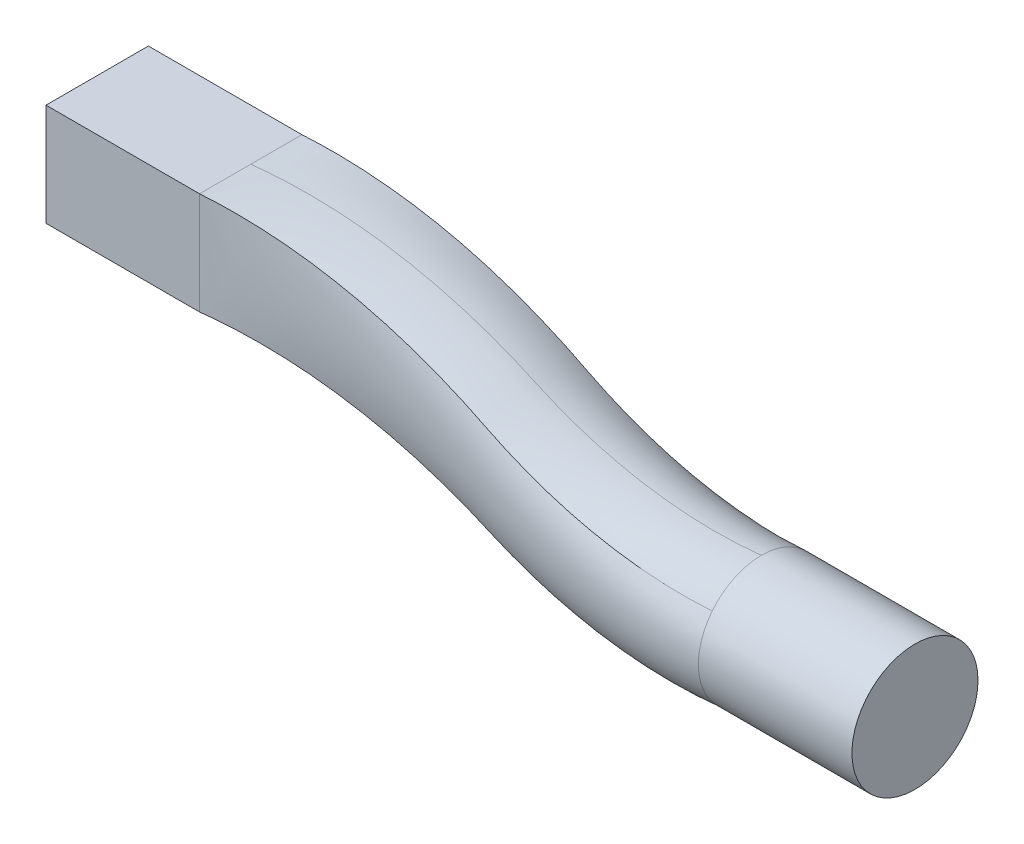
ISO-10303-21;
HEADER;
FILE_DESCRIPTION(('STEP AP214'),'2;1');
FILE_NAME('part.step','',(''),(''),'','','');
FILE_SCHEMA(('AUTOMOTIVE_DESIGN { 1 0 10303 214 1 1 1 1 }'));
ENDSEC;
DATA;
#1=APPLICATION_CONTEXT('core data for automotive mechanical design processes');
#2=APPLICATION_PROTOCOL_DEFINITION('international standard','automotive_design',2000,#1);
#3=PRODUCT_CONTEXT('',#1,'mechanical');
#4=PRODUCT('Part','Part','',(#3));
#5=PRODUCT_RELATED_PRODUCT_CATEGORY('part','',(#4));
#6=PRODUCT_DEFINITION_FORMATION('','',#4);
#7=PRODUCT_DEFINITION_CONTEXT('part definition',#1,'design');
#8=PRODUCT_DEFINITION('design','',#6,#7);
#9=PRODUCT_DEFINITION_SHAPE('','',#8);
#10=(LENGTH_UNIT() NAMED_UNIT(*) SI_UNIT(.MILLI.,.METRE.));
#11=(NAMED_UNIT(*) PLANE_ANGLE_UNIT() SI_UNIT($,.RADIAN.));
#12=(NAMED_UNIT(*) SI_UNIT($,.STERADIAN.) SOLID_ANGLE_UNIT());
#13=UNCERTAINTY_MEASURE_WITH_UNIT(LENGTH_MEASURE(1.E-05),#10,'distance_accuracy_value','');
#14=(GEOMETRIC_REPRESENTATION_CONTEXT(3) GLOBAL_UNCERTAINTY_ASSIGNED_CONTEXT((#13)) GLOBAL_UNIT_ASSIGNED_CONTEXT((#10,
#11,#12)) REPRESENTATION_CONTEXT('',''));
#15=CARTESIAN_POINT('',(0.,0.,0.));
#16=DIRECTION('',(0.,0.,1.));
#17=DIRECTION('',(1.,0.,0.));
#18=AXIS2_PLACEMENT_3D('',#15,#16,#17);
#19=CARTESIAN_POINT('',(1018.70288688526,-111.327969278225,98.1786354112722));
#20=CARTESIAN_POINT('',(864.195022169251,-121.253897370635,98.7596032718136));
#21=CARTESIAN_POINT('',(707.982737110856,-88.8067003141855,99.340571132355));
#22=CARTESIAN_POINT('',(389.792361381204,73.7067384013296,100.650359328598));
#23=CARTESIAN_POINT('',(193.839936106772,114.46066408754,101.379179664299));
#24=CARTESIAN_POINT('',(0.,102.108,102.108));
#25=CARTESIAN_POINT('',(1018.70288688526,-107.823826946939,95.375321546243));
#26=CARTESIAN_POINT('',(864.195022169251,-118.26785256562,95.7101235236934));
#27=CARTESIAN_POINT('',(707.982737110856,-86.3387530354427,96.0449255011437));
#28=CARTESIAN_POINT('',(389.792361381204,75.0066382363103,96.7997343432964));
#29=CARTESIAN_POINT('',(193.839936106772,115.11061400503,97.2197412079987));
#30=CARTESIAN_POINT('',(0.,102.108,97.639748072701));
#31=CARTESIAN_POINT('',(1018.70288688526,-101.04186585455,89.3334158306901));
#32=CARTESIAN_POINT('',(864.195022169251,-112.488623934715,89.2574022157566));
#33=CARTESIAN_POINT('',(707.982737110856,-81.5622568660207,89.181388600823));
#34=CARTESIAN_POINT('',(389.792361381204,77.5224807082695,89.0100164090793));
#35=CARTESIAN_POINT('',(193.839936106772,116.36853524101,88.914657832269));
#36=CARTESIAN_POINT('',(0.,102.108,88.8192992554588));
#37=CARTESIAN_POINT('',(1018.70288688526,-91.7521778938547,79.0307499945835));
#38=CARTESIAN_POINT('',(864.195022169253,-104.572443068552,78.5615032950265));
#39=CARTESIAN_POINT('',(707.982737110858,-75.0195830943902,78.0922565954694));
#40=CARTESIAN_POINT('',(389.792361381205,80.9685918263349,77.0343430171986));
#41=CARTESIAN_POINT('',(193.839936106772,118.091590800043,76.4456761384849));
#42=CARTESIAN_POINT('',(0.,102.108,75.8570092597712));
#43=CARTESIAN_POINT('',(1018.70288688526,-83.5443662608268,67.5978041436648));
#44=CARTESIAN_POINT('',(864.195022169248,-97.5781800020903,66.9303247638813));
#45=CARTESIAN_POINT('',(707.982737110854,-69.2388685944949,66.2628453840979));
#46=CARTESIAN_POINT('',(389.792361381203,84.0133691152208,64.7580175403322));
#47=CARTESIAN_POINT('',(193.839936106771,119.613979444486,63.92066907635));
#48=CARTESIAN_POINT('',(0.,102.108,63.0833206123677));
#49=CARTESIAN_POINT('',(1018.70288688527,-76.5998022636083,55.1867324526258));
#50=CARTESIAN_POINT('',(864.195022169254,-91.6603897736971,54.4847712146526));
#51=CARTESIAN_POINT('',(707.982737110859,-64.3478521349271,53.7828099766794));
#52=CARTESIAN_POINT('',(389.792361381206,86.5895309090492,52.2002430118558));
#53=CARTESIAN_POINT('',(193.839936106773,120.9020603414,51.3196372850053));
#54=CARTESIAN_POINT('',(0.,102.108,50.4390315581548));
#55=CARTESIAN_POINT('',(1018.70288688526,-71.0710045535372,41.9885353472462));
#56=CARTESIAN_POINT('',(864.195022169249,-86.9490407132628,41.3788499607623));
#57=CARTESIAN_POINT('',(707.982737110855,-60.4539517241296,40.7691645742784));
#58=CARTESIAN_POINT('',(389.792361381204,88.6404987498229,39.3946329058759));
#59=CARTESIAN_POINT('',(193.839936106772,121.927544261787,38.6297866239573));
#60=CARTESIAN_POINT('',(0.,102.108,37.8649403420387));
#61=CARTESIAN_POINT('',(1018.70288688527,-67.071410201011,28.2249488574512));
#62=CARTESIAN_POINT('',(864.195022169254,-83.5407978939302,27.7935983640975));
#63=CARTESIAN_POINT('',(707.982737110858,-57.6370604379905,27.3622478707438));
#64=CARTESIAN_POINT('',(389.792361381205,90.1241919184533,26.3897710385288));
#65=CARTESIAN_POINT('',(193.839936106773,122.669390846102,25.8486446996674));
#66=CARTESIAN_POINT('',(0.,102.108,25.307518360806));
#67=CARTESIAN_POINT('',(1018.70288688526,-64.667830339664,14.1371488318967));
#68=CARTESIAN_POINT('',(864.195022169248,-81.4925942309876,13.9266193721418));
#69=CARTESIAN_POINT('',(707.982737110854,-55.9442329734523,13.7160899123869));
#70=CARTESIAN_POINT('',(389.792361381203,91.0158260958758,13.2414526388356));
#71=CARTESIAN_POINT('',(193.839936106771,123.115207934813,12.9773448250392));
#72=CARTESIAN_POINT('',(0.,102.108,12.7132370112428));
#73=CARTESIAN_POINT('',(1018.70288688526,-64.1408776072428,4.69421010416392));
#74=CARTESIAN_POINT('',(864.195022169251,-81.0435529762744,4.62919770007005));
#75=CARTESIAN_POINT('',(707.982737110856,-55.5731031964471,4.56418529597617));
#76=CARTESIAN_POINT('',(389.792361381204,91.2113049620739,4.41761526125487));
#77=CARTESIAN_POINT('',(193.839936106772,123.212947367912,4.33605763062744));
#78=CARTESIAN_POINT('',(0.,102.108,4.25450000000002));
#79=CARTESIAN_POINT('',(1018.70288688526,-64.1408776072428,0.));
#80=CARTESIAN_POINT('',(864.195022169251,-81.0435529762744,0.));
#81=CARTESIAN_POINT('',(707.982737110856,-55.5731031964471,0.));
#82=CARTESIAN_POINT('',(389.792361381204,91.2113049620739,0.));
#83=CARTESIAN_POINT('',(193.839936106772,123.212947367912,0.));
#84=CARTESIAN_POINT('',(0.,102.108,0.));
#85=B_SPLINE_SURFACE_WITH_KNOTS('',3,3,((#19,#20,#21,#22,#23,#24),(#25,#26,#27,#28,#29,#30),
(#31,#32,#33,#34,#35,#36),(#37,#38,#39,#40,#41,#42),(#43,#44,#45,#46,#47,#48),(#49,#50,#51,#52,
#53,#54),(#55,#56,#57,#58,#59,#60),(#61,#62,#63,#64,#65,#66),(#67,#68,#69,#70,#71,#72),(#73,#74,
#75,#76,#77,#78),(#79,#80,#81,#82,#83,#84)),.UNSPECIFIED.,.F.,.F.,.F.,(4,1,1,1,1,1,1,1,4),(4,2,
4),(0.866194178130681,0.882919905864346,0.899645633598011,0.916371361331675,0.93309708906534,
0.949822816799005,0.96654854453267,0.983274272266335,1.),(0.,0.443558632004796,1.),.UNSPECIFIED.);
#86=CARTESIAN_POINT('',(1018.70288688526,-189.870877607243,0.));
#87=DIRECTION('',(1.,0.,0.));
#88=DIRECTION('',(0.,0.,-1.));
#89=AXIS2_PLACEMENT_3D('',#86,#87,#88);
#90=CIRCLE('',#89,125.73);
#91=CARTESIAN_POINT('',(1018.70288688526,-64.1408776072428,0.));
#92=VERTEX_POINT('',#91);
#93=CARTESIAN_POINT('',(1018.70288688526,-111.327525114457,98.1791907450501));
#94=VERTEX_POINT('',#93);
#95=EDGE_CURVE('E209',#92,#94,#90,.T.);
#96=CARTESIAN_POINT('',(1018.70288688526,-64.1408776072428,0.));
#97=CARTESIAN_POINT('',(864.195022169251,-81.0435529762744,0.));
#98=CARTESIAN_POINT('',(707.982737110856,-55.5731031964471,0.));
#99=CARTESIAN_POINT('',(389.792361381204,91.2113049620739,0.));
#100=CARTESIAN_POINT('',(193.839936106772,123.212947367912,0.));
#101=CARTESIAN_POINT('',(0.,102.108,0.));
#102=B_SPLINE_CURVE_WITH_KNOTS('',3,(#96,#97,#98,#99,#100,#101),.UNSPECIFIED.,.F.,.F.,(4,2,4),
(0.,0.443558632004796,1.),.UNSPECIFIED.);
#103=CARTESIAN_POINT('',(0.,102.108,0.));
#104=VERTEX_POINT('',#103);
#105=EDGE_CURVE('E213',#92,#104,#102,.T.);
#106=DIRECTION('',(0.,0.,1.));
#107=VECTOR('',#106,1.);
#108=CARTESIAN_POINT('',(0.,102.108,102.108));
#109=LINE('',#108,#107);
#110=CARTESIAN_POINT('',(0.,102.108,102.108));
#111=VERTEX_POINT('',#110);
#112=EDGE_CURVE('E147',#104,#111,#109,.T.);
#113=CARTESIAN_POINT('',(1018.70288688526,-111.327969278225,98.1786354112722));
#114=CARTESIAN_POINT('',(864.195022169251,-121.253897370635,98.7596032718136));
#115=CARTESIAN_POINT('',(707.982737110856,-88.8067003141855,99.340571132355));
#116=CARTESIAN_POINT('',(389.792361381204,73.7067384013296,100.650359328598));
#117=CARTESIAN_POINT('',(193.839936106772,114.46066408754,101.379179664299));
#118=CARTESIAN_POINT('',(0.,102.108,102.108));
#119=B_SPLINE_CURVE_WITH_KNOTS('',3,(#113,#114,#115,#116,#117,#118),.UNSPECIFIED.,.F.,.F.,(4,2,
4),(0.,0.443558632004796,1.),.UNSPECIFIED.);
#120=EDGE_CURVE('E200',#94,#111,#119,.T.);
#121=ORIENTED_EDGE('',*,*,#95,.F.);
#122=ORIENTED_EDGE('',*,*,#105,.T.);
#123=ORIENTED_EDGE('',*,*,#112,.T.);
#124=ORIENTED_EDGE('',*,*,#120,.F.);
#125=EDGE_LOOP('',(#121,#122,#123,#124));
#126=FACE_BOUND('',#125,.T.);
#127=ADVANCED_FACE('F127',(#126),#85,.T.);
#128=CARTESIAN_POINT('',(1018.70288688526,-286.459339091021,80.4903845698151));
#129=CARTESIAN_POINT('',(864.195022169251,-300.685513442831,83.686611212288));
#130=CARTESIAN_POINT('',(707.982737110856,-272.538562645782,86.8828378547608));
#131=CARTESIAN_POINT('',(389.792361381204,-119.720000659335,94.0887096648224));
#132=CARTESIAN_POINT('',(193.839936106772,-84.3607054427924,98.0983548324112));
#133=CARTESIAN_POINT('',(0.,-102.108,102.108));
#134=CARTESIAN_POINT('',(1018.70288688526,-281.258322152728,86.7316048957664));
#135=CARTESIAN_POINT('',(864.195022169251,-294.99540169069,89.0050491549661));
#136=CARTESIAN_POINT('',(707.982737110856,-266.359356079792,91.2784934141658));
#137=CARTESIAN_POINT('',(389.792361381204,-112.438133072776,96.4039584489103));
#138=CARTESIAN_POINT('',(193.839936106772,-76.4652716495128,99.2559792244551));
#139=CARTESIAN_POINT('',(0.,-93.599,102.108));
#140=CARTESIAN_POINT('',(1018.70288688526,-269.643096812058,98.2028128454199));
#141=CARTESIAN_POINT('',(864.195022169251,-282.581360571045,98.780206002756));
#142=CARTESIAN_POINT('',(707.982737110856,-253.146499181174,99.3575991600921));
#143=CARTESIAN_POINT('',(389.792361381204,-97.4243512877144,100.659328211619));
#144=CARTESIAN_POINT('',(193.839936106772,-60.4493807569819,101.383664105809));
#145=CARTESIAN_POINT('',(0.,-76.581,102.108));
#146=CARTESIAN_POINT('',(1018.70288688526,-249.231114305797,111.730439961954));
#147=CARTESIAN_POINT('',(864.195022169252,-261.413108010717,110.307734526597));
#148=CARTESIAN_POINT('',(707.982737110857,-231.221976566777,108.885029091239));
#149=CARTESIAN_POINT('',(389.792361381205,-73.7948228420716,105.677549103921));
#150=CARTESIAN_POINT('',(193.839936106772,-35.8711165341605,103.89277455196));
#151=CARTESIAN_POINT('',(0.,-51.054,102.108));
#152=CARTESIAN_POINT('',(1018.70288688526,-226.595858990808,121.072864844824));
#153=CARTESIAN_POINT('',(864.195022169249,-238.35029992353,118.268855009249));
#154=CARTESIAN_POINT('',(707.982737110855,-207.731615707394,115.464845173673));
#155=CARTESIAN_POINT('',(389.792361381203,-49.3405470876849,109.143223558732));
#156=CARTESIAN_POINT('',(193.839936106772,-10.8804786569672,105.625611779366));
#157=CARTESIAN_POINT('',(0.,-25.527,102.108));
#158=CARTESIAN_POINT('',(1018.70288688526,-202.584715671556,125.879709403632));
#159=CARTESIAN_POINT('',(864.195022169253,-214.115032832403,122.364993769135));
#160=CARTESIAN_POINT('',(707.982737110858,-183.272224844391,118.850278134638));
#161=CARTESIAN_POINT('',(389.792361381205,-24.3758706644319,110.926375000094));
#162=CARTESIAN_POINT('',(193.839936106772,14.3653595546593,106.517187500047));
#163=CARTESIAN_POINT('',(0.,0.,102.108));
#164=CARTESIAN_POINT('',(1018.70288688526,-178.097323295751,125.971212101141));
#165=CARTESIAN_POINT('',(864.195022169248,-189.473931478062,122.442967529534));
#166=CARTESIAN_POINT('',(707.982737110854,-158.477414511513,118.914722957926));
#167=CARTESIAN_POINT('',(389.792361381203,0.76547554317781,110.960318924212));
#168=CARTESIAN_POINT('',(193.839936106771,39.6995326584642,106.534159462106));
#169=CARTESIAN_POINT('',(0.,25.527,102.108));
#170=CARTESIAN_POINT('',(1018.70288688527,-154.051096874945,121.343612206372));
#171=CARTESIAN_POINT('',(864.195022169254,-165.20876842289,118.499571594361));
#172=CARTESIAN_POINT('',(707.982737110859,-133.993314821976,115.65553098235));
#173=CARTESIAN_POINT('',(389.792361381206,25.7431664257794,109.243660246892));
#174=CARTESIAN_POINT('',(193.839936106773,64.951878099765,105.675830123446));
#175=CARTESIAN_POINT('',(0.,51.054,102.108));
#176=CARTESIAN_POINT('',(1018.70288688526,-131.346369087056,112.170768518737));
#177=CARTESIAN_POINT('',(864.195022169249,-142.086759567818,110.682959239287));
#178=CARTESIAN_POINT('',(707.982737110855,-110.454024899721,109.195149959836));
#179=CARTESIAN_POINT('',(389.792361381203,50.2232137520715,105.840893786924));
#180=CARTESIAN_POINT('',(193.839936106772,89.955401762911,103.974446893462));
#181=CARTESIAN_POINT('',(0.,76.581,102.108));
#182=CARTESIAN_POINT('',(1018.70288688526,-117.671941275397,103.25381300901));
#183=CARTESIAN_POINT('',(864.195022169251,-127.917974987535,103.08440125874));
#184=CARTESIAN_POINT('',(707.982737110856,-95.790883550815,102.91498950847));
#185=CARTESIAN_POINT('',(389.792361381204,66.0008791637573,102.5330518388));
#186=CARTESIAN_POINT('',(193.839936106772,106.353234468754,102.3205259194));
#187=CARTESIAN_POINT('',(0.,93.5989999999999,102.108));
#188=CARTESIAN_POINT('',(1018.70288688526,-111.327969278225,98.1786354112722));
#189=CARTESIAN_POINT('',(864.195022169251,-121.253897370635,98.7596032718136));
#190=CARTESIAN_POINT('',(707.982737110856,-88.8067003141855,99.340571132355));
#191=CARTESIAN_POINT('',(389.792361381204,73.7067384013296,100.650359328598));
#192=CARTESIAN_POINT('',(193.839936106772,114.46066408754,101.379179664299));
#193=CARTESIAN_POINT('',(0.,102.108,102.108));
#194=B_SPLINE_SURFACE_WITH_KNOTS('',3,3,((#128,#129,#130,#131,#132,#133),(#134,#135,#136,#137,
#138,#139),(#140,#141,#142,#143,#144,#145),(#146,#147,#148,#149,#150,#151),(#152,#153,#154,#155,
#156,#157),(#158,#159,#160,#161,#162,#163),(#164,#165,#166,#167,#168,#169),(#170,#171,#172,#173,
#174,#175),(#176,#177,#178,#179,#180,#181),(#182,#183,#184,#185,#186,#187),(#188,#189,#190,#191,
#192,#193)),.UNSPECIFIED.,.F.,.F.,.F.,(4,1,1,1,1,1,1,1,4),(4,2,4),(0.617785515405924,
0.648836598246519,0.679887681087113,0.710938763927708,0.741989846768302,0.773040929608897,
0.804092012449491,0.835143095290086,0.866194178130681),(0.,0.443558632004796,1.),.UNSPECIFIED.);
#195=CARTESIAN_POINT('',(1018.70288688526,-286.459891797474,80.4908452308721));
#196=VERTEX_POINT('',#195);
#197=EDGE_CURVE('E195',#94,#196,#90,.T.);
#198=DIRECTION('',(0.,-1.,0.));
#199=VECTOR('',#198,1.);
#200=CARTESIAN_POINT('',(0.,-102.108,102.108));
#201=LINE('',#200,#199);
#202=CARTESIAN_POINT('',(0.,-102.108,102.108));
#203=VERTEX_POINT('',#202);
#204=EDGE_CURVE('E139',#111,#203,#201,.T.);
#205=CARTESIAN_POINT('',(1018.70288688526,-286.459339091021,80.4903845698151));
#206=CARTESIAN_POINT('',(864.195022169251,-300.685513442831,83.686611212288));
#207=CARTESIAN_POINT('',(707.982737110856,-272.538562645782,86.8828378547608));
#208=CARTESIAN_POINT('',(389.792361381204,-119.720000659335,94.0887096648224));
#209=CARTESIAN_POINT('',(193.839936106772,-84.3607054427924,98.0983548324112));
#210=CARTESIAN_POINT('',(0.,-102.108,102.108));
#211=B_SPLINE_CURVE_WITH_KNOTS('',3,(#205,#206,#207,#208,#209,#210),.UNSPECIFIED.,.F.,.F.,(4,2,
4),(0.,0.443558632004796,1.),.UNSPECIFIED.);
#212=EDGE_CURVE('E201',#196,#203,#211,.T.);
#213=ORIENTED_EDGE('',*,*,#197,.F.);
#214=ORIENTED_EDGE('',*,*,#120,.T.);
#215=ORIENTED_EDGE('',*,*,#204,.T.);
#216=ORIENTED_EDGE('',*,*,#212,.F.);
#217=EDGE_LOOP('',(#213,#214,#215,#216));
#218=FACE_BOUND('',#217,.T.);
#219=ADVANCED_FACE('F198',(#218),#194,.T.);
#220=CARTESIAN_POINT('',(1018.70288688526,-286.459339091021,-80.490384569815));
#221=CARTESIAN_POINT('',(864.195022169251,-300.685513442831,-83.6866112122879));
#222=CARTESIAN_POINT('',(707.982737110856,-272.538562645782,-86.8828378547607));
#223=CARTESIAN_POINT('',(389.792361381204,-119.720000659335,-94.0887096648224));
#224=CARTESIAN_POINT('',(193.839936106772,-84.3607054427924,-98.0983548324112));
#225=CARTESIAN_POINT('',(0.,-102.108,-102.108));
#226=CARTESIAN_POINT('',(1018.70288688526,-291.119318307225,-74.8984095103695));
#227=CARTESIAN_POINT('',(864.195022169251,-304.656501323599,-77.6633456221237));
#228=CARTESIAN_POINT('',(707.982737110856,-275.820559191113,-80.4282817338778));
#229=CARTESIAN_POINT('',(389.792361381204,-121.448670799265,-86.6618118970879));
#230=CARTESIAN_POINT('',(193.839936106772,-85.2250405127571,-90.130405948544));
#231=CARTESIAN_POINT('',(0.,-102.108,-93.599));
#232=CARTESIAN_POINT('',(1018.70288688526,-299.465746418484,-62.9033218375022));
#233=CARTESIAN_POINT('',(864.195022169251,-311.768886023139,-64.9256059090886));
#234=CARTESIAN_POINT('',(707.982737110856,-281.698900478935,-66.9478899806751));
#235=CARTESIAN_POINT('',(389.792361381204,-124.544869383333,-71.5071160348411));
#236=CARTESIAN_POINT('',(193.839936106772,-86.7731398047912,-74.0440580174205));
#237=CARTESIAN_POINT('',(0.,-102.108,-76.581));
#238=CARTESIAN_POINT('',(1018.70288688526,-308.68720185109,-43.017416685339));
#239=CARTESIAN_POINT('',(864.195022169251,-319.626922736818,-44.2056486523535));
#240=CARTESIAN_POINT('',(707.982737110857,-288.193518473687,-45.3938806193681));
#241=CARTESIAN_POINT('',(389.792361381204,-127.965668900551,-48.0727417242551));
#242=CARTESIAN_POINT('',(193.839936106772,-88.4835395634,-49.5633708621275));
#243=CARTESIAN_POINT('',(0.,-102.108,-51.054));
#244=CARTESIAN_POINT('',(1018.70288688526,-314.333612472915,-21.8372991318411));
#245=CARTESIAN_POINT('',(864.195022169249,-324.438495301591,-22.3828320217036));
#246=CARTESIAN_POINT('',(707.982737110855,-292.170252981409,-22.9283649115661));
#247=CARTESIAN_POINT('',(389.792361381203,-130.060266534331,-24.1582652009524));
#248=CARTESIAN_POINT('',(193.839936106772,-89.5308383802902,-24.8426326004762));
#249=CARTESIAN_POINT('',(0.,-102.108,-25.527));
#250=CARTESIAN_POINT('',(1018.70288688527,-316.234740662694,0.));
#251=CARTESIAN_POINT('',(864.195022169254,-326.05853621833,0.));
#252=CARTESIAN_POINT('',(707.982737110859,-293.509206625106,0.));
#253=CARTESIAN_POINT('',(389.792361381206,-130.765510781434,0.));
#254=CARTESIAN_POINT('',(193.839936106773,-89.8834605038419,0.));
#255=CARTESIAN_POINT('',(0.,-102.108,0.));
#256=CARTESIAN_POINT('',(1018.70288688526,-314.333612472915,21.8372991318411));
#257=CARTESIAN_POINT('',(864.195022169248,-324.438495301592,22.3828320217035));
#258=CARTESIAN_POINT('',(707.982737110854,-292.17025298141,22.928364911566));
#259=CARTESIAN_POINT('',(389.792361381203,-130.060266534331,24.1582652009523));
#260=CARTESIAN_POINT('',(193.839936106771,-89.5308383802902,24.8426326004761));
#261=CARTESIAN_POINT('',(0.,-102.108,25.527));
#262=CARTESIAN_POINT('',(1018.70288688527,-308.687201851091,43.0174166853391));
#263=CARTESIAN_POINT('',(864.195022169255,-319.626922736819,44.2056486523536));
#264=CARTESIAN_POINT('',(707.98273711086,-288.193518473688,45.3938806193681));
#265=CARTESIAN_POINT('',(389.792361381206,-127.965668900551,48.0727417242551));
#266=CARTESIAN_POINT('',(193.839936106773,-88.4835395634001,49.5633708621275));
#267=CARTESIAN_POINT('',(0.,-102.108,51.054));
#268=CARTESIAN_POINT('',(1018.70288688526,-299.465746418484,62.9033218375021));
#269=CARTESIAN_POINT('',(864.195022169248,-311.768886023139,64.9256059090886));
#270=CARTESIAN_POINT('',(707.982737110854,-281.698900478934,66.9478899806751));
#271=CARTESIAN_POINT('',(389.792361381203,-124.544869383333,71.507116034841));
#272=CARTESIAN_POINT('',(193.839936106771,-86.7731398047912,74.0440580174205));
#273=CARTESIAN_POINT('',(0.,-102.108,76.581));
#274=CARTESIAN_POINT('',(1018.70288688526,-291.119318307225,74.8984095103697));
#275=CARTESIAN_POINT('',(864.195022169251,-304.656501323599,77.6633456221238));
#276=CARTESIAN_POINT('',(707.982737110856,-275.820559191113,80.4282817338779));
#277=CARTESIAN_POINT('',(389.792361381204,-121.448670799265,86.661811897088));
#278=CARTESIAN_POINT('',(193.839936106772,-85.2250405127571,90.130405948544));
#279=CARTESIAN_POINT('',(0.,-102.108,93.599));
#280=CARTESIAN_POINT('',(1018.70288688526,-286.459339091021,80.4903845698151));
#281=CARTESIAN_POINT('',(864.195022169251,-300.685513442831,83.686611212288));
#282=CARTESIAN_POINT('',(707.982737110856,-272.538562645782,86.8828378547608));
#283=CARTESIAN_POINT('',(389.792361381204,-119.720000659335,94.0887096648224));
#284=CARTESIAN_POINT('',(193.839936106772,-84.3607054427924,98.0983548324112));
#285=CARTESIAN_POINT('',(0.,-102.108,102.108));
#286=B_SPLINE_SURFACE_WITH_KNOTS('',3,3,((#220,#221,#222,#223,#224,#225),(#226,#227,#228,#229,
#230,#231),(#232,#233,#234,#235,#236,#237),(#238,#239,#240,#241,#242,#243),(#244,#245,#246,#247,
#248,#249),(#250,#251,#252,#253,#254,#255),(#256,#257,#258,#259,#260,#261),(#262,#263,#264,#265,
#266,#267),(#268,#269,#270,#271,#272,#273),(#274,#275,#276,#277,#278,#279),(#280,#281,#282,#283,
#284,#285)),.UNSPECIFIED.,.F.,.F.,.F.,(4,1,1,1,1,1,1,1,4),(4,2,4),(0.382214484594076,
0.411660863445557,0.441107242297038,0.470553621148519,0.5,0.529446378851481,0.558892757702962,
0.588339136554443,0.617785515405924),(0.,0.443558632004796,1.),.UNSPECIFIED.);
#287=CARTESIAN_POINT('',(1018.70288688526,-286.459895793234,-80.4908485529679));
#288=VERTEX_POINT('',#287);
#289=EDGE_CURVE('E133',#196,#288,#90,.T.);
#290=DIRECTION('',(0.,0.,-1.));
#291=VECTOR('',#290,1.);
#292=CARTESIAN_POINT('',(0.,-102.108,102.108));
#293=LINE('',#292,#291);
#294=CARTESIAN_POINT('',(0.,-102.108,-102.108));
#295=VERTEX_POINT('',#294);
#296=EDGE_CURVE('E13',#203,#295,#293,.T.);
#297=CARTESIAN_POINT('',(1018.70288688526,-286.459339091021,-80.490384569815));
#298=CARTESIAN_POINT('',(864.195022169251,-300.685513442831,-83.6866112122879));
#299=CARTESIAN_POINT('',(707.982737110856,-272.538562645782,-86.8828378547607));
#300=CARTESIAN_POINT('',(389.792361381204,-119.720000659335,-94.0887096648224));
#301=CARTESIAN_POINT('',(193.839936106772,-84.3607054427924,-98.0983548324112));
#302=CARTESIAN_POINT('',(0.,-102.108,-102.108));
#303=B_SPLINE_CURVE_WITH_KNOTS('',3,(#297,#298,#299,#300,#301,#302),.UNSPECIFIED.,.F.,.F.,(4,2,
4),(0.,0.443558632004796,1.),.UNSPECIFIED.);
#304=EDGE_CURVE('E339',#288,#295,#303,.T.);
#305=ORIENTED_EDGE('',*,*,#289,.F.);
#306=ORIENTED_EDGE('',*,*,#212,.T.);
#307=ORIENTED_EDGE('',*,*,#296,.T.);
#308=ORIENTED_EDGE('',*,*,#304,.F.);
#309=EDGE_LOOP('',(#305,#306,#307,#308));
#310=FACE_BOUND('',#309,.T.);
#311=ADVANCED_FACE('F387',(#310),#286,.T.);
#312=CARTESIAN_POINT('',(1018.70288688526,-111.327969278225,-98.1786354112722));
#313=CARTESIAN_POINT('',(864.195022169251,-121.253897370635,-98.7596032718136));
#314=CARTESIAN_POINT('',(707.982737110856,-88.8067003141855,-99.340571132355));
#315=CARTESIAN_POINT('',(389.792361381204,73.7067384013296,-100.650359328598));
#316=CARTESIAN_POINT('',(193.839936106772,114.46066408754,-101.379179664299));
#317=CARTESIAN_POINT('',(0.,102.108,-102.108));
#318=CARTESIAN_POINT('',(1018.70288688526,-117.671941275397,-103.25381300901));
#319=CARTESIAN_POINT('',(864.195022169251,-127.917974987535,-103.08440125874));
#320=CARTESIAN_POINT('',(707.982737110856,-95.790883550815,-102.91498950847));
#321=CARTESIAN_POINT('',(389.792361381204,66.0008791637573,-102.5330518388));
#322=CARTESIAN_POINT('',(193.839936106772,106.353234468754,-102.3205259194));
#323=CARTESIAN_POINT('',(0.,93.599,-102.108));
#324=CARTESIAN_POINT('',(1018.70288688527,-131.346369087056,-112.170768518737));
#325=CARTESIAN_POINT('',(864.195022169254,-142.086759567818,-110.682959239286));
#326=CARTESIAN_POINT('',(707.982737110859,-110.454024899721,-109.195149959836));
#327=CARTESIAN_POINT('',(389.792361381206,50.2232137520713,-105.840893786923));
#328=CARTESIAN_POINT('',(193.839936106773,89.9554017629109,-103.974446893462));
#329=CARTESIAN_POINT('',(0.,76.581,-102.108));
#330=CARTESIAN_POINT('',(1018.70288688526,-154.051096874944,-121.343612206372));
#331=CARTESIAN_POINT('',(864.195022169247,-165.208768422889,-118.499571594361));
#332=CARTESIAN_POINT('',(707.982737110853,-133.993314821975,-115.65553098235));
#333=CARTESIAN_POINT('',(389.792361381203,25.7431664257796,-109.243660246893));
#334=CARTESIAN_POINT('',(193.839936106771,64.9518780997651,-105.675830123446));
#335=CARTESIAN_POINT('',(0.,51.054,-102.108));
#336=CARTESIAN_POINT('',(1018.70288688527,-178.097323295752,-125.971212101141));
#337=CARTESIAN_POINT('',(864.195022169254,-189.473931478062,-122.442967529533));
#338=CARTESIAN_POINT('',(707.982737110858,-158.477414511513,-118.914722957926));
#339=CARTESIAN_POINT('',(389.792361381205,0.765475543177602,-110.960318924212));
#340=CARTESIAN_POINT('',(193.839936106772,39.6995326584641,-106.534159462106));
#341=CARTESIAN_POINT('',(0.,25.527,-102.108));
#342=CARTESIAN_POINT('',(1018.70288688526,-202.584715671556,-125.879709403632));
#343=CARTESIAN_POINT('',(864.195022169249,-214.115032832403,-122.364993769135));
#344=CARTESIAN_POINT('',(707.982737110854,-183.272224844391,-118.850278134638));
#345=CARTESIAN_POINT('',(389.792361381203,-24.3758706644318,-110.926375000094));
#346=CARTESIAN_POINT('',(193.839936106771,14.3653595546594,-106.517187500047));
#347=CARTESIAN_POINT('',(0.,0.,-102.108));
#348=CARTESIAN_POINT('',(1018.70288688526,-226.595858990808,-121.072864844824));
#349=CARTESIAN_POINT('',(864.195022169252,-238.350299923531,-118.268855009249));
#350=CARTESIAN_POINT('',(707.982737110857,-207.731615707395,-115.464845173673));
#351=CARTESIAN_POINT('',(389.792361381205,-49.3405470876851,-109.143223558732));
#352=CARTESIAN_POINT('',(193.839936106772,-10.8804786569673,-105.625611779366));
#353=CARTESIAN_POINT('',(0.,-25.527,-102.108));
#354=CARTESIAN_POINT('',(1018.70288688526,-249.231114305797,-111.730439961954));
#355=CARTESIAN_POINT('',(864.19502216925,-261.413108010717,-110.307734526597));
#356=CARTESIAN_POINT('',(707.982737110855,-231.221976566777,-108.885029091239));
#357=CARTESIAN_POINT('',(389.792361381204,-73.7948228420716,-105.677549103921));
#358=CARTESIAN_POINT('',(193.839936106772,-35.8711165341605,-103.89277455196));
#359=CARTESIAN_POINT('',(0.,-51.054,-102.108));
#360=CARTESIAN_POINT('',(1018.70288688526,-269.643096812058,-98.2028128454197));
#361=CARTESIAN_POINT('',(864.195022169253,-282.581360571045,-98.7802060027559));
#362=CARTESIAN_POINT('',(707.982737110858,-253.146499181174,-99.357599160092));
#363=CARTESIAN_POINT('',(389.792361381205,-97.4243512877143,-100.659328211619));
#364=CARTESIAN_POINT('',(193.839936106772,-60.4493807569819,-101.383664105809));
#365=CARTESIAN_POINT('',(0.,-76.581,-102.108));
#366=CARTESIAN_POINT('',(1018.70288688526,-281.258322152728,-86.7316048957663));
#367=CARTESIAN_POINT('',(864.195022169251,-294.99540169069,-89.005049154966));
#368=CARTESIAN_POINT('',(707.982737110856,-266.359356079793,-91.2784934141657));
#369=CARTESIAN_POINT('',(389.792361381204,-112.438133072776,-96.4039584489103));
#370=CARTESIAN_POINT('',(193.839936106772,-76.4652716495129,-99.2559792244551));
#371=CARTESIAN_POINT('',(0.,-93.599,-102.108));
#372=CARTESIAN_POINT('',(1018.70288688526,-286.459339091021,-80.490384569815));
#373=CARTESIAN_POINT('',(864.195022169251,-300.685513442831,-83.6866112122879));
#374=CARTESIAN_POINT('',(707.982737110856,-272.538562645782,-86.8828378547607));
#375=CARTESIAN_POINT('',(389.792361381204,-119.720000659335,-94.0887096648224));
#376=CARTESIAN_POINT('',(193.839936106772,-84.3607054427924,-98.0983548324112));
#377=CARTESIAN_POINT('',(0.,-102.108,-102.108));
#378=B_SPLINE_SURFACE_WITH_KNOTS('',3,3,((#312,#313,#314,#315,#316,#317),(#318,#319,#320,#321,
#322,#323),(#324,#325,#326,#327,#328,#329),(#330,#331,#332,#333,#334,#335),(#336,#337,#338,#339,
#340,#341),(#342,#343,#344,#345,#346,#347),(#348,#349,#350,#351,#352,#353),(#354,#355,#356,#357,
#358,#359),(#360,#361,#362,#363,#364,#365),(#366,#367,#368,#369,#370,#371),(#372,#373,#374,#375,
#376,#377)),.UNSPECIFIED.,.F.,.F.,.F.,(4,1,1,1,1,1,1,1,4),(4,2,4),(0.133805821869319,
0.164856904709914,0.195907987550509,0.226959070391103,0.258010153231698,0.289061236072292,
0.320112318912887,0.351163401753482,0.382214484594076),(0.,0.443558632004796,1.),.UNSPECIFIED.);
#379=CARTESIAN_POINT('',(1018.70288688526,-111.327527539231,-98.179187724188));
#380=VERTEX_POINT('',#379);
#381=EDGE_CURVE('E230',#288,#380,#90,.T.);
#382=DIRECTION('',(0.,1.,0.));
#383=VECTOR('',#382,1.);
#384=CARTESIAN_POINT('',(0.,-102.108,-102.108));
#385=LINE('',#384,#383);
#386=CARTESIAN_POINT('',(0.,102.108,-102.108));
#387=VERTEX_POINT('',#386);
#388=EDGE_CURVE('E253',#295,#387,#385,.T.);
#389=CARTESIAN_POINT('',(1018.70288688526,-111.327969278225,-98.1786354112722));
#390=CARTESIAN_POINT('',(864.195022169251,-121.253897370635,-98.7596032718136));
#391=CARTESIAN_POINT('',(707.982737110856,-88.8067003141855,-99.340571132355));
#392=CARTESIAN_POINT('',(389.792361381204,73.7067384013296,-100.650359328598));
#393=CARTESIAN_POINT('',(193.839936106772,114.46066408754,-101.379179664299));
#394=CARTESIAN_POINT('',(0.,102.108,-102.108));
#395=B_SPLINE_CURVE_WITH_KNOTS('',3,(#389,#390,#391,#392,#393,#394),.UNSPECIFIED.,.F.,.F.,(4,2,
4),(0.,0.443558632004796,1.),.UNSPECIFIED.);
#396=EDGE_CURVE('E205',#380,#387,#395,.T.);
#397=ORIENTED_EDGE('',*,*,#381,.F.);
#398=ORIENTED_EDGE('',*,*,#304,.T.);
#399=ORIENTED_EDGE('',*,*,#388,.T.);
#400=ORIENTED_EDGE('',*,*,#396,.F.);
#401=EDGE_LOOP('',(#397,#398,#399,#400));
#402=FACE_BOUND('',#401,.T.);
#403=ADVANCED_FACE('F303',(#402),#378,.T.);
#404=CARTESIAN_POINT('',(1018.70288688526,-64.1408776072428,0.));
#405=CARTESIAN_POINT('',(864.195022169251,-81.0435529762744,0.));
#406=CARTESIAN_POINT('',(707.982737110856,-55.5731031964471,0.));
#407=CARTESIAN_POINT('',(389.792361381204,91.2113049620739,0.));
#408=CARTESIAN_POINT('',(193.839936106772,123.212947367912,0.));
#409=CARTESIAN_POINT('',(0.,102.108,0.));
#410=CARTESIAN_POINT('',(1018.70288688526,-64.1408776072428,-4.69421010416391));
#411=CARTESIAN_POINT('',(864.195022169251,-81.0435529762744,-4.62919770007003));
#412=CARTESIAN_POINT('',(707.982737110856,-55.5731031964471,-4.56418529597615));
#413=CARTESIAN_POINT('',(389.792361381204,91.2113049620739,-4.41761526125485));
#414=CARTESIAN_POINT('',(193.839936106772,123.212947367912,-4.33605763062742));
#415=CARTESIAN_POINT('',(0.,102.108,-4.2545));
#416=CARTESIAN_POINT('',(1018.70288688526,-64.6678303396644,-14.1371488318967));
#417=CARTESIAN_POINT('',(864.19502216925,-81.4925942309879,-13.9266193721418));
#418=CARTESIAN_POINT('',(707.982737110855,-55.9442329734526,-13.7160899123869));
#419=CARTESIAN_POINT('',(389.792361381204,91.0158260958756,-13.2414526388356));
#420=CARTESIAN_POINT('',(193.839936106772,123.115207934813,-12.9773448250392));
#421=CARTESIAN_POINT('',(0.,102.108,-12.7132370112427));
#422=CARTESIAN_POINT('',(1018.70288688526,-67.0714102010106,-28.2249488574512));
#423=CARTESIAN_POINT('',(864.195022169252,-83.5407978939298,-27.7935983640975));
#424=CARTESIAN_POINT('',(707.982737110857,-57.6370604379902,-27.3622478707438));
#425=CARTESIAN_POINT('',(389.792361381205,90.1241919184534,-26.3897710385287));
#426=CARTESIAN_POINT('',(193.839936106772,122.669390846102,-25.8486446996673));
#427=CARTESIAN_POINT('',(0.,102.108,-25.3075183608059));
#428=CARTESIAN_POINT('',(1018.70288688526,-71.0710045535376,-41.9885353472462));
#429=CARTESIAN_POINT('',(864.195022169249,-86.9490407132631,-41.3788499607623));
#430=CARTESIAN_POINT('',(707.982737110855,-60.4539517241298,-40.7691645742784));
#431=CARTESIAN_POINT('',(389.792361381203,88.6404987498228,-39.3946329058759));
#432=CARTESIAN_POINT('',(193.839936106771,121.927544261787,-38.6297866239573));
#433=CARTESIAN_POINT('',(0.,102.108,-37.8649403420387));
#434=CARTESIAN_POINT('',(1018.70288688527,-76.5998022636082,-55.1867324526257));
#435=CARTESIAN_POINT('',(864.195022169256,-91.660389773697,-54.4847712146526));
#436=CARTESIAN_POINT('',(707.98273711086,-64.347852134927,-53.7828099766794));
#437=CARTESIAN_POINT('',(389.792361381206,86.5895309090492,-52.2002430118558));
#438=CARTESIAN_POINT('',(193.839936106773,120.9020603414,-51.3196372850053));
#439=CARTESIAN_POINT('',(0.,102.108,-50.4390315581548));
#440=CARTESIAN_POINT('',(1018.70288688526,-83.5443662608272,-67.5978041436649));
#441=CARTESIAN_POINT('',(864.195022169247,-97.5781800020906,-66.9303247638815));
#442=CARTESIAN_POINT('',(707.982737110853,-69.2388685944952,-66.262845384098));
#443=CARTESIAN_POINT('',(389.792361381203,84.0133691152207,-64.7580175403323));
#444=CARTESIAN_POINT('',(193.839936106771,119.613979444486,-63.92066907635));
#445=CARTESIAN_POINT('',(0.,102.108,-63.0833206123677));
#446=CARTESIAN_POINT('',(1018.70288688527,-91.7521778938545,-79.0307499945834));
#447=CARTESIAN_POINT('',(864.195022169253,-104.572443068552,-78.5615032950263));
#448=CARTESIAN_POINT('',(707.982737110858,-75.0195830943901,-78.0922565954693));
#449=CARTESIAN_POINT('',(389.792361381205,80.9685918263349,-77.0343430171985));
#450=CARTESIAN_POINT('',(193.839936106772,118.091590800043,-76.4456761384849));
#451=CARTESIAN_POINT('',(0.,102.108,-75.8570092597712));
#452=CARTESIAN_POINT('',(1018.70288688526,-101.04186585455,-89.3334158306902));
#453=CARTESIAN_POINT('',(864.19502216925,-112.488623934715,-89.2574022157567));
#454=CARTESIAN_POINT('',(707.982737110855,-81.5622568660208,-89.1813886008231));
#455=CARTESIAN_POINT('',(389.792361381204,77.5224807082694,-89.0100164090793));
#456=CARTESIAN_POINT('',(193.839936106772,116.36853524101,-88.9146578322691));
#457=CARTESIAN_POINT('',(0.,102.108,-88.8192992554588));
#458=CARTESIAN_POINT('',(1018.70288688526,-107.823826946939,-95.375321546243));
#459=CARTESIAN_POINT('',(864.195022169251,-118.26785256562,-95.7101235236934));
#460=CARTESIAN_POINT('',(707.982737110856,-86.3387530354427,-96.0449255011437));
#461=CARTESIAN_POINT('',(389.792361381204,75.0066382363103,-96.7997343432964));
#462=CARTESIAN_POINT('',(193.839936106772,115.11061400503,-97.2197412079987));
#463=CARTESIAN_POINT('',(0.,102.108,-97.639748072701));
#464=CARTESIAN_POINT('',(1018.70288688526,-111.327969278225,-98.1786354112722));
#465=CARTESIAN_POINT('',(864.195022169251,-121.253897370635,-98.7596032718136));
#466=CARTESIAN_POINT('',(707.982737110856,-88.8067003141855,-99.340571132355));
#467=CARTESIAN_POINT('',(389.792361381204,73.7067384013296,-100.650359328598));
#468=CARTESIAN_POINT('',(193.839936106772,114.46066408754,-101.379179664299));
#469=CARTESIAN_POINT('',(0.,102.108,-102.108));
#470=B_SPLINE_SURFACE_WITH_KNOTS('',3,3,((#404,#405,#406,#407,#408,#409),(#410,#411,#412,#413,
#414,#415),(#416,#417,#418,#419,#420,#421),(#422,#423,#424,#425,#426,#427),(#428,#429,#430,#431,
#432,#433),(#434,#435,#436,#437,#438,#439),(#440,#441,#442,#443,#444,#445),(#446,#447,#448,#449,
#450,#451),(#452,#453,#454,#455,#456,#457),(#458,#459,#460,#461,#462,#463),(#464,#465,#466,#467,
#468,#469)),.UNSPECIFIED.,.F.,.F.,.F.,(4,1,1,1,1,1,1,1,4),(4,2,4),(0.,0.0167257277336649,
0.0334514554673298,0.0501771832009947,0.0669029109346597,0.0836286386683246,0.100354366401989,
0.117080094135654,0.133805821869319),(0.,0.443558632004796,1.),.UNSPECIFIED.);
#471=EDGE_CURVE('E219',#380,#92,#90,.T.);
#472=EDGE_CURVE('E252',#387,#104,#109,.T.);
#473=ORIENTED_EDGE('',*,*,#471,.F.);
#474=ORIENTED_EDGE('',*,*,#396,.T.);
#475=ORIENTED_EDGE('',*,*,#472,.T.);
#476=ORIENTED_EDGE('',*,*,#105,.F.);
#477=EDGE_LOOP('',(#473,#474,#475,#476));
#478=FACE_BOUND('',#477,.T.);
#479=ADVANCED_FACE('F295',(#478),#470,.T.);
#480=CARTESIAN_POINT('',(-306.324,102.108,-102.108));
#481=DIRECTION('',(0.,0.,1.));
#482=DIRECTION('',(1.,0.,0.));
#483=AXIS2_PLACEMENT_3D('',#480,#481,#482);
#484=PLANE('',#483);
#485=ORIENTED_EDGE('',*,*,#388,.F.);
#486=DIRECTION('',(1.,0.,0.));
#487=VECTOR('',#486,1.);
#488=CARTESIAN_POINT('',(-306.324,-102.108,-102.108));
#489=LINE('',#488,#487);
#490=CARTESIAN_POINT('',(-306.324,-102.108,-102.108));
#491=VERTEX_POINT('',#490);
#492=EDGE_CURVE('E221',#491,#295,#489,.T.);
#493=ORIENTED_EDGE('',*,*,#492,.F.);
#494=DIRECTION('',(0.,-1.,0.));
#495=VECTOR('',#494,1.);
#496=CARTESIAN_POINT('',(-306.324,102.108,-102.108));
#497=LINE('',#496,#495);
#498=CARTESIAN_POINT('',(-306.324,102.108,-102.108));
#499=VERTEX_POINT('',#498);
#500=EDGE_CURVE('E231',#499,#491,#497,.T.);
#501=ORIENTED_EDGE('',*,*,#500,.F.);
#502=DIRECTION('',(1.,0.,0.));
#503=VECTOR('',#502,1.);
#504=CARTESIAN_POINT('',(-306.324,102.108,-102.108));
#505=LINE('',#504,#503);
#506=EDGE_CURVE('E240',#499,#387,#505,.T.);
#507=ORIENTED_EDGE('',*,*,#506,.T.);
#508=EDGE_LOOP('',(#485,#493,#501,#507));
#509=FACE_BOUND('',#508,.T.);
#510=ADVANCED_FACE('F284',(#509),#484,.F.);
#511=CARTESIAN_POINT('',(-306.324,-102.108,102.108));
#512=DIRECTION('',(0.,1.,0.));
#513=DIRECTION('',(0.,0.,1.));
#514=AXIS2_PLACEMENT_3D('',#511,#512,#513);
#515=PLANE('',#514);
#516=ORIENTED_EDGE('',*,*,#296,.F.);
#517=DIRECTION('',(1.,0.,0.));
#518=VECTOR('',#517,1.);
#519=CARTESIAN_POINT('',(-306.324,-102.108,102.108));
#520=LINE('',#519,#518);
#521=CARTESIAN_POINT('',(-306.324,-102.108,102.108));
#522=VERTEX_POINT('',#521);
#523=EDGE_CURVE('E530',#522,#203,#520,.T.);
#524=ORIENTED_EDGE('',*,*,#523,.F.);
#525=DIRECTION('',(0.,0.,1.));
#526=VECTOR('',#525,1.);
#527=CARTESIAN_POINT('',(-306.324,-102.108,102.108));
#528=LINE('',#527,#526);
#529=EDGE_CURVE('E234',#491,#522,#528,.T.);
#530=ORIENTED_EDGE('',*,*,#529,.F.);
#531=ORIENTED_EDGE('',*,*,#492,.T.);
#532=EDGE_LOOP('',(#516,#524,#530,#531));
#533=FACE_BOUND('',#532,.T.);
#534=ADVANCED_FACE('F294',(#533),#515,.F.);
#535=CARTESIAN_POINT('',(-306.324,102.108,102.108));
#536=DIRECTION('',(0.,0.,-1.));
#537=DIRECTION('',(-1.,0.,0.));
#538=AXIS2_PLACEMENT_3D('',#535,#536,#537);
#539=PLANE('',#538);
#540=ORIENTED_EDGE('',*,*,#204,.F.);
#541=DIRECTION('',(1.,0.,0.));
#542=VECTOR('',#541,1.);
#543=CARTESIAN_POINT('',(-306.324,102.108,102.108));
#544=LINE('',#543,#542);
#545=CARTESIAN_POINT('',(-306.324,102.108,102.108));
#546=VERTEX_POINT('',#545);
#547=EDGE_CURVE('E527',#546,#111,#544,.T.);
#548=ORIENTED_EDGE('',*,*,#547,.F.);
#549=DIRECTION('',(0.,1.,0.));
#550=VECTOR('',#549,1.);
#551=CARTESIAN_POINT('',(-306.324,102.108,102.108));
#552=LINE('',#551,#550);
#553=EDGE_CURVE('E237',#522,#546,#552,.T.);
#554=ORIENTED_EDGE('',*,*,#553,.F.);
#555=ORIENTED_EDGE('',*,*,#523,.T.);
#556=EDGE_LOOP('',(#540,#548,#554,#555));
#557=FACE_BOUND('',#556,.T.);
#558=ADVANCED_FACE('F514',(#557),#539,.F.);
#559=CARTESIAN_POINT('',(-306.324,102.108,102.108));
#560=DIRECTION('',(0.,-1.,0.));
#561=DIRECTION('',(0.,0.,-1.));
#562=AXIS2_PLACEMENT_3D('',#559,#560,#561);
#563=PLANE('',#562);
#564=ORIENTED_EDGE('',*,*,#112,.F.);
#565=ORIENTED_EDGE('',*,*,#472,.F.);
#566=ORIENTED_EDGE('',*,*,#506,.F.);
#567=DIRECTION('',(0.,0.,-1.));
#568=VECTOR('',#567,1.);
#569=CARTESIAN_POINT('',(-306.324,102.108,102.108));
#570=LINE('',#569,#568);
#571=EDGE_CURVE('E239',#546,#499,#570,.T.);
#572=ORIENTED_EDGE('',*,*,#571,.F.);
#573=ORIENTED_EDGE('',*,*,#547,.T.);
#574=EDGE_LOOP('',(#564,#565,#566,#572,#573));
#575=FACE_BOUND('',#574,.T.);
#576=ADVANCED_FACE('F510',(#575),#563,.F.);
#577=CARTESIAN_POINT('',(-306.324,0.,0.));
#578=DIRECTION('',(1.,0.,0.));
#579=DIRECTION('',(0.,0.,-1.));
#580=AXIS2_PLACEMENT_3D('',#577,#578,#579);
#581=PLANE('',#580);
#582=ORIENTED_EDGE('',*,*,#500,.T.);
#583=ORIENTED_EDGE('',*,*,#529,.T.);
#584=ORIENTED_EDGE('',*,*,#553,.T.);
#585=ORIENTED_EDGE('',*,*,#571,.T.);
#586=EDGE_LOOP('',(#582,#583,#584,#585));
#587=FACE_BOUND('',#586,.T.);
#588=ADVANCED_FACE('F461',(#587),#581,.F.);
#589=CARTESIAN_POINT('',(1325.02688688526,-189.870877607243,0.));
#590=DIRECTION('',(-1.,0.,0.));
#591=DIRECTION('',(0.,0.,1.));
#592=AXIS2_PLACEMENT_3D('',#589,#590,#591);
#593=CYLINDRICAL_SURFACE('',#592,125.73);
#594=CARTESIAN_POINT('',(1325.02688688526,-189.870877607243,0.));
#595=DIRECTION('',(1.,0.,0.));
#596=DIRECTION('',(0.,0.,-1.));
#597=AXIS2_PLACEMENT_3D('',#594,#595,#596);
#598=CIRCLE('',#597,125.73);
#599=CARTESIAN_POINT('',(1325.02688688526,-189.870877607243,-125.73));
#600=VERTEX_POINT('',#599);
#601=EDGE_CURVE('E235',#600,#600,#598,.T.);
#602=ORIENTED_EDGE('',*,*,#601,.F.);
#603=EDGE_LOOP('',(#602));
#604=FACE_BOUND('',#603,.T.);
#605=ORIENTED_EDGE('',*,*,#471,.T.);
#606=ORIENTED_EDGE('',*,*,#95,.T.);
#607=ORIENTED_EDGE('',*,*,#197,.T.);
#608=ORIENTED_EDGE('',*,*,#289,.T.);
#609=ORIENTED_EDGE('',*,*,#381,.T.);
#610=EDGE_LOOP('',(#605,#606,#607,#608,#609));
#611=FACE_BOUND('',#610,.T.);
#612=ADVANCED_FACE('F217',(#604,#611),#593,.T.);
#613=CARTESIAN_POINT('',(1325.02688688526,-189.870877607243,0.));
#614=DIRECTION('',(1.,0.,0.));
#615=DIRECTION('',(0.,0.,-1.));
#616=AXIS2_PLACEMENT_3D('',#613,#614,#615);
#617=PLANE('',#616);
#618=ORIENTED_EDGE('',*,*,#601,.T.);
#619=EDGE_LOOP('',(#618));
#620=FACE_BOUND('',#619,.T.);
#621=ADVANCED_FACE('F494',(#620),#617,.T.);
#622=CLOSED_SHELL('',(#127,#219,#311,#403,#479,#510,#534,#558,#576,#588,#612,#621));
#623=MANIFOLD_SOLID_BREP('B2',#622);
#624=ADVANCED_BREP_SHAPE_REPRESENTATION('',(#18,#623),#14);
#625=SHAPE_DEFINITION_REPRESENTATION(#9,#624);
ENDSEC;
END-ISO-10303-21;
